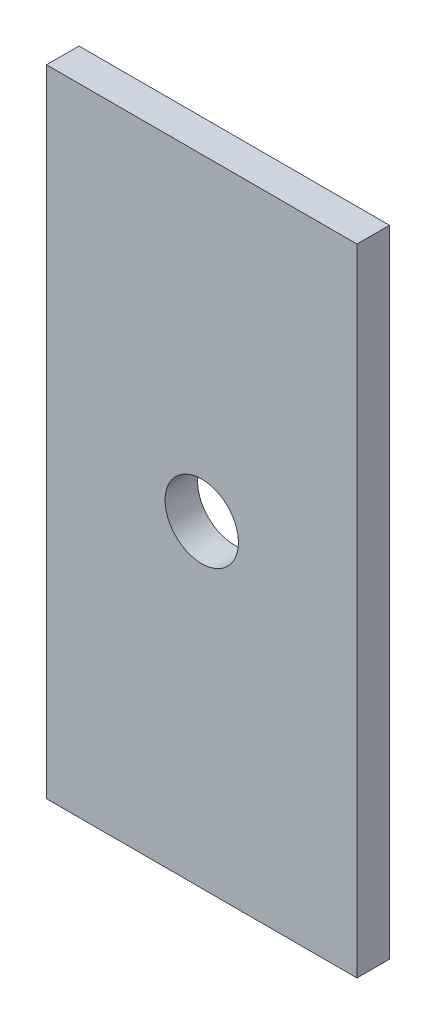
ISO-10303-21;
HEADER;
FILE_DESCRIPTION(('STEP AP214'),'2;1');
FILE_NAME('part.step','',(''),(''),'','','');
FILE_SCHEMA(('AUTOMOTIVE_DESIGN { 1 0 10303 214 1 1 1 1 }'));
ENDSEC;
DATA;
#1=APPLICATION_CONTEXT('core data for automotive mechanical design processes');
#2=APPLICATION_PROTOCOL_DEFINITION('international standard','automotive_design',2000,#1);
#3=PRODUCT_CONTEXT('',#1,'mechanical');
#4=PRODUCT('Part','Part','',(#3));
#5=PRODUCT_RELATED_PRODUCT_CATEGORY('part','',(#4));
#6=PRODUCT_DEFINITION_FORMATION('','',#4);
#7=PRODUCT_DEFINITION_CONTEXT('part definition',#1,'design');
#8=PRODUCT_DEFINITION('design','',#6,#7);
#9=PRODUCT_DEFINITION_SHAPE('','',#8);
#10=(LENGTH_UNIT() NAMED_UNIT(*) SI_UNIT(.MILLI.,.METRE.));
#11=(NAMED_UNIT(*) PLANE_ANGLE_UNIT() SI_UNIT($,.RADIAN.));
#12=(NAMED_UNIT(*) SI_UNIT($,.STERADIAN.) SOLID_ANGLE_UNIT());
#13=UNCERTAINTY_MEASURE_WITH_UNIT(LENGTH_MEASURE(1.E-05),#10,'distance_accuracy_value','');
#14=(GEOMETRIC_REPRESENTATION_CONTEXT(3) GLOBAL_UNCERTAINTY_ASSIGNED_CONTEXT((#13)) GLOBAL_UNIT_ASSIGNED_CONTEXT((#10,
#11,#12)) REPRESENTATION_CONTEXT('',''));
#15=CARTESIAN_POINT('',(0.,0.,0.));
#16=DIRECTION('',(0.,0.,1.));
#17=DIRECTION('',(1.,0.,0.));
#18=AXIS2_PLACEMENT_3D('',#15,#16,#17);
#19=CARTESIAN_POINT('',(0.,0.,2.66));
#20=DIRECTION('',(1.,0.,0.));
#21=DIRECTION('',(0.,1.,0.));
#22=AXIS2_PLACEMENT_3D('',#19,#20,#21);
#23=PLANE('',#22);
#24=DIRECTION('',(0.,-1.,0.));
#25=VECTOR('',#24,1.);
#26=CARTESIAN_POINT('',(0.,0.,0.));
#27=LINE('',#26,#25);
#28=CARTESIAN_POINT('',(0.,52.,0.));
#29=VERTEX_POINT('',#28);
#30=CARTESIAN_POINT('',(0.,0.,0.));
#31=VERTEX_POINT('',#30);
#32=EDGE_CURVE('E106',#29,#31,#27,.T.);
#33=ORIENTED_EDGE('',*,*,#32,.T.);
#34=DIRECTION('',(0.,0.,-1.));
#35=VECTOR('',#34,1.);
#36=CARTESIAN_POINT('',(0.,0.,2.66));
#37=LINE('',#36,#35);
#38=CARTESIAN_POINT('',(0.,0.,2.66));
#39=VERTEX_POINT('',#38);
#40=EDGE_CURVE('E11',#39,#31,#37,.T.);
#41=ORIENTED_EDGE('',*,*,#40,.F.);
#42=DIRECTION('',(0.,-1.,0.));
#43=VECTOR('',#42,1.);
#44=CARTESIAN_POINT('',(0.,0.,2.66));
#45=LINE('',#44,#43);
#46=CARTESIAN_POINT('',(0.,52.,2.66));
#47=VERTEX_POINT('',#46);
#48=EDGE_CURVE('E94',#47,#39,#45,.T.);
#49=ORIENTED_EDGE('',*,*,#48,.F.);
#50=DIRECTION('',(0.,0.,-1.));
#51=VECTOR('',#50,1.);
#52=CARTESIAN_POINT('',(0.,52.,2.66));
#53=LINE('',#52,#51);
#54=EDGE_CURVE('E102',#47,#29,#53,.T.);
#55=ORIENTED_EDGE('',*,*,#54,.T.);
#56=EDGE_LOOP('',(#33,#41,#49,#55));
#57=FACE_BOUND('',#56,.T.);
#58=ADVANCED_FACE('F43',(#57),#23,.F.);
#59=CARTESIAN_POINT('',(0.,0.,2.66));
#60=DIRECTION('',(0.,1.,0.));
#61=DIRECTION('',(0.,0.,1.));
#62=AXIS2_PLACEMENT_3D('',#59,#60,#61);
#63=PLANE('',#62);
#64=DIRECTION('',(1.,0.,0.));
#65=VECTOR('',#64,1.);
#66=CARTESIAN_POINT('',(0.,0.,0.));
#67=LINE('',#66,#65);
#68=CARTESIAN_POINT('',(25.4,0.,0.));
#69=VERTEX_POINT('',#68);
#70=EDGE_CURVE('E98',#31,#69,#67,.T.);
#71=ORIENTED_EDGE('',*,*,#70,.T.);
#72=DIRECTION('',(0.,0.,-1.));
#73=VECTOR('',#72,1.);
#74=CARTESIAN_POINT('',(25.4,0.,2.66));
#75=LINE('',#74,#73);
#76=CARTESIAN_POINT('',(25.4,0.,2.66));
#77=VERTEX_POINT('',#76);
#78=EDGE_CURVE('E51',#77,#69,#75,.T.);
#79=ORIENTED_EDGE('',*,*,#78,.F.);
#80=DIRECTION('',(1.,0.,0.));
#81=VECTOR('',#80,1.);
#82=CARTESIAN_POINT('',(0.,0.,2.66));
#83=LINE('',#82,#81);
#84=EDGE_CURVE('E89',#39,#77,#83,.T.);
#85=ORIENTED_EDGE('',*,*,#84,.F.);
#86=ORIENTED_EDGE('',*,*,#40,.T.);
#87=EDGE_LOOP('',(#71,#79,#85,#86));
#88=FACE_BOUND('',#87,.T.);
#89=ADVANCED_FACE('F97',(#88),#63,.F.);
#90=CARTESIAN_POINT('',(25.4,0.,2.66));
#91=DIRECTION('',(-1.,0.,0.));
#92=DIRECTION('',(0.,-1.,0.));
#93=AXIS2_PLACEMENT_3D('',#90,#91,#92);
#94=PLANE('',#93);
#95=DIRECTION('',(0.,1.,0.));
#96=VECTOR('',#95,1.);
#97=CARTESIAN_POINT('',(25.4,0.,0.));
#98=LINE('',#97,#96);
#99=CARTESIAN_POINT('',(25.4,52.,0.));
#100=VERTEX_POINT('',#99);
#101=EDGE_CURVE('E76',#69,#100,#98,.T.);
#102=ORIENTED_EDGE('',*,*,#101,.T.);
#103=DIRECTION('',(0.,0.,-1.));
#104=VECTOR('',#103,1.);
#105=CARTESIAN_POINT('',(25.4,52.,2.66));
#106=LINE('',#105,#104);
#107=CARTESIAN_POINT('',(25.4,52.,2.66));
#108=VERTEX_POINT('',#107);
#109=EDGE_CURVE('E99',#108,#100,#106,.T.);
#110=ORIENTED_EDGE('',*,*,#109,.F.);
#111=DIRECTION('',(0.,1.,0.));
#112=VECTOR('',#111,1.);
#113=CARTESIAN_POINT('',(25.4,0.,2.66));
#114=LINE('',#113,#112);
#115=EDGE_CURVE('E92',#77,#108,#114,.T.);
#116=ORIENTED_EDGE('',*,*,#115,.F.);
#117=ORIENTED_EDGE('',*,*,#78,.T.);
#118=EDGE_LOOP('',(#102,#110,#116,#117));
#119=FACE_BOUND('',#118,.T.);
#120=ADVANCED_FACE('F100',(#119),#94,.F.);
#121=CARTESIAN_POINT('',(0.,52.,2.66));
#122=DIRECTION('',(0.,-1.,0.));
#123=DIRECTION('',(0.,0.,-1.));
#124=AXIS2_PLACEMENT_3D('',#121,#122,#123);
#125=PLANE('',#124);
#126=DIRECTION('',(-1.,0.,0.));
#127=VECTOR('',#126,1.);
#128=CARTESIAN_POINT('',(0.,52.,0.));
#129=LINE('',#128,#127);
#130=EDGE_CURVE('E82',#100,#29,#129,.T.);
#131=ORIENTED_EDGE('',*,*,#130,.T.);
#132=ORIENTED_EDGE('',*,*,#54,.F.);
#133=DIRECTION('',(-1.,0.,0.));
#134=VECTOR('',#133,1.);
#135=CARTESIAN_POINT('',(0.,52.,2.66));
#136=LINE('',#135,#134);
#137=EDGE_CURVE('E59',#108,#47,#136,.T.);
#138=ORIENTED_EDGE('',*,*,#137,.F.);
#139=ORIENTED_EDGE('',*,*,#109,.T.);
#140=EDGE_LOOP('',(#131,#132,#138,#139));
#141=FACE_BOUND('',#140,.T.);
#142=ADVANCED_FACE('F114',(#141),#125,.F.);
#143=CARTESIAN_POINT('',(0.,0.,2.66));
#144=DIRECTION('',(0.,0.,-1.));
#145=DIRECTION('',(-1.,0.,0.));
#146=AXIS2_PLACEMENT_3D('',#143,#144,#145);
#147=PLANE('',#146);
#148=CARTESIAN_POINT('',(12.7,26.,2.66));
#149=DIRECTION('',(0.,0.,-1.));
#150=DIRECTION('',(-1.,0.,0.));
#151=AXIS2_PLACEMENT_3D('',#148,#149,#150);
#152=CIRCLE('',#151,3.);
#153=CARTESIAN_POINT('',(9.69999999999999,26.,2.66));
#154=VERTEX_POINT('',#153);
#155=EDGE_CURVE('E109',#154,#154,#152,.T.);
#156=ORIENTED_EDGE('',*,*,#155,.T.);
#157=EDGE_LOOP('',(#156));
#158=FACE_BOUND('',#157,.T.);
#159=ORIENTED_EDGE('',*,*,#48,.T.);
#160=ORIENTED_EDGE('',*,*,#84,.T.);
#161=ORIENTED_EDGE('',*,*,#115,.T.);
#162=ORIENTED_EDGE('',*,*,#137,.T.);
#163=EDGE_LOOP('',(#159,#160,#161,#162));
#164=FACE_BOUND('',#163,.T.);
#165=ADVANCED_FACE('F90',(#158,#164),#147,.F.);
#166=CARTESIAN_POINT('',(0.,0.,0.));
#167=DIRECTION('',(0.,0.,-1.));
#168=DIRECTION('',(-1.,0.,0.));
#169=AXIS2_PLACEMENT_3D('',#166,#167,#168);
#170=PLANE('',#169);
#171=CARTESIAN_POINT('',(12.7,26.,0.));
#172=DIRECTION('',(0.,0.,-1.));
#173=DIRECTION('',(-1.,0.,0.));
#174=AXIS2_PLACEMENT_3D('',#171,#172,#173);
#175=CIRCLE('',#174,3.);
#176=CARTESIAN_POINT('',(9.69999999999999,26.,0.));
#177=VERTEX_POINT('',#176);
#178=EDGE_CURVE('E122',#177,#177,#175,.T.);
#179=ORIENTED_EDGE('',*,*,#178,.F.);
#180=EDGE_LOOP('',(#179));
#181=FACE_BOUND('',#180,.T.);
#182=ORIENTED_EDGE('',*,*,#32,.F.);
#183=ORIENTED_EDGE('',*,*,#130,.F.);
#184=ORIENTED_EDGE('',*,*,#101,.F.);
#185=ORIENTED_EDGE('',*,*,#70,.F.);
#186=EDGE_LOOP('',(#182,#183,#184,#185));
#187=FACE_BOUND('',#186,.T.);
#188=ADVANCED_FACE('F117',(#181,#187),#170,.T.);
#189=CARTESIAN_POINT('',(12.7,26.,30.));
#190=DIRECTION('',(0.,0.,-1.));
#191=DIRECTION('',(-1.,0.,0.));
#192=AXIS2_PLACEMENT_3D('',#189,#190,#191);
#193=CYLINDRICAL_SURFACE('',#192,3.);
#194=ORIENTED_EDGE('',*,*,#178,.T.);
#195=EDGE_LOOP('',(#194));
#196=FACE_BOUND('',#195,.T.);
#197=ORIENTED_EDGE('',*,*,#155,.F.);
#198=EDGE_LOOP('',(#197));
#199=FACE_BOUND('',#198,.T.);
#200=ADVANCED_FACE('F126',(#196,#199),#193,.F.);
#201=CLOSED_SHELL('',(#58,#89,#120,#142,#165,#188,#200));
#202=MANIFOLD_SOLID_BREP('B2',#201);
#203=ADVANCED_BREP_SHAPE_REPRESENTATION('',(#18,#202),#14);
#204=SHAPE_DEFINITION_REPRESENTATION(#9,#203);
ENDSEC;
END-ISO-10303-21;
